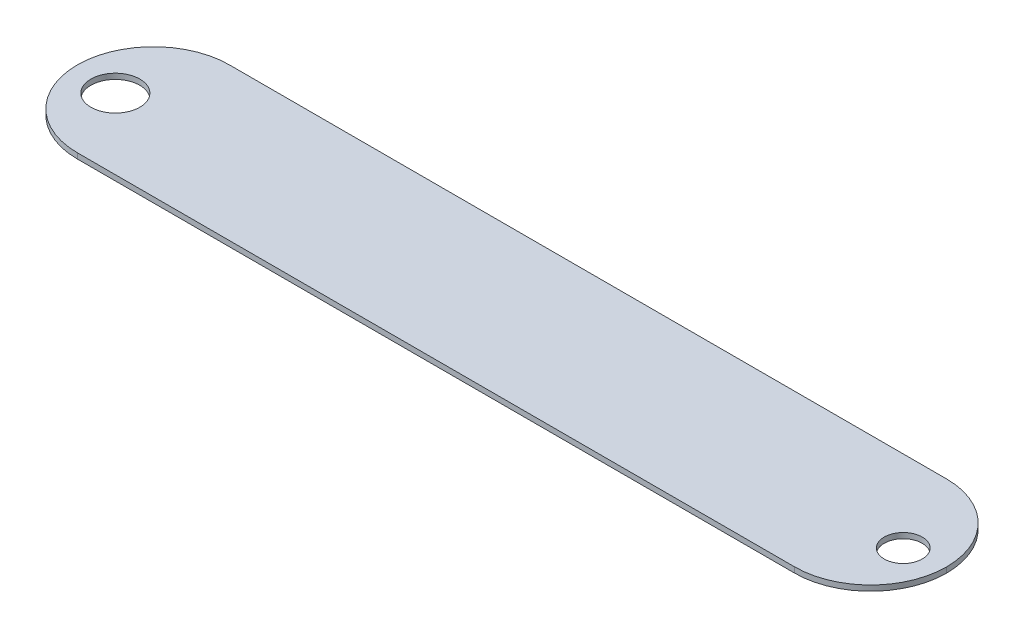
ISO-10303-21;
HEADER;
FILE_DESCRIPTION(('STEP AP214'),'2;1');
FILE_NAME('part.step','',(''),(''),'','','');
FILE_SCHEMA(('AUTOMOTIVE_DESIGN { 1 0 10303 214 1 1 1 1 }'));
ENDSEC;
DATA;
#1=APPLICATION_CONTEXT('core data for automotive mechanical design processes');
#2=APPLICATION_PROTOCOL_DEFINITION('international standard','automotive_design',2000,#1);
#3=PRODUCT_CONTEXT('',#1,'mechanical');
#4=PRODUCT('Part','Part','',(#3));
#5=PRODUCT_RELATED_PRODUCT_CATEGORY('part','',(#4));
#6=PRODUCT_DEFINITION_FORMATION('','',#4);
#7=PRODUCT_DEFINITION_CONTEXT('part definition',#1,'design');
#8=PRODUCT_DEFINITION('design','',#6,#7);
#9=PRODUCT_DEFINITION_SHAPE('','',#8);
#10=(LENGTH_UNIT() NAMED_UNIT(*) SI_UNIT(.MILLI.,.METRE.));
#11=(NAMED_UNIT(*) PLANE_ANGLE_UNIT() SI_UNIT($,.RADIAN.));
#12=(NAMED_UNIT(*) SI_UNIT($,.STERADIAN.) SOLID_ANGLE_UNIT());
#13=UNCERTAINTY_MEASURE_WITH_UNIT(LENGTH_MEASURE(1.E-05),#10,'distance_accuracy_value','');
#14=(GEOMETRIC_REPRESENTATION_CONTEXT(3) GLOBAL_UNCERTAINTY_ASSIGNED_CONTEXT((#13)) GLOBAL_UNIT_ASSIGNED_CONTEXT((#10,
#11,#12)) REPRESENTATION_CONTEXT('',''));
#15=CARTESIAN_POINT('',(0.,0.,0.));
#16=DIRECTION('',(0.,0.,1.));
#17=DIRECTION('',(1.,0.,0.));
#18=AXIS2_PLACEMENT_3D('',#15,#16,#17);
#19=CARTESIAN_POINT('',(0.,0.5,0.));
#20=DIRECTION('',(0.,1.,0.));
#21=DIRECTION('',(0.,0.,1.));
#22=AXIS2_PLACEMENT_3D('',#19,#20,#21);
#23=PLANE('',#22);
#24=CARTESIAN_POINT('',(4.,0.5,7.5));
#25=DIRECTION('',(0.,1.,0.));
#26=DIRECTION('',(0.,0.,1.));
#27=AXIS2_PLACEMENT_3D('',#24,#25,#26);
#28=CIRCLE('',#27,2.25);
#29=CARTESIAN_POINT('',(4.,0.5,9.75));
#30=VERTEX_POINT('',#29);
#31=EDGE_CURVE('E141',#30,#30,#28,.T.);
#32=ORIENTED_EDGE('',*,*,#31,.F.);
#33=EDGE_LOOP('',(#32));
#34=FACE_BOUND('',#33,.T.);
#35=CARTESIAN_POINT('',(73.,0.5,7.));
#36=DIRECTION('',(0.,1.,0.));
#37=DIRECTION('',(0.,0.,1.));
#38=AXIS2_PLACEMENT_3D('',#35,#36,#37);
#39=CIRCLE('',#38,7.);
#40=CARTESIAN_POINT('',(73.,0.5,14.));
#41=VERTEX_POINT('',#40);
#42=CARTESIAN_POINT('',(80.,0.5,7.));
#43=VERTEX_POINT('',#42);
#44=EDGE_CURVE('E52',#41,#43,#39,.T.);
#45=ORIENTED_EDGE('',*,*,#44,.T.);
#46=CARTESIAN_POINT('',(73.,0.5,7.));
#47=DIRECTION('',(0.,1.,0.));
#48=DIRECTION('',(0.,0.,1.));
#49=AXIS2_PLACEMENT_3D('',#46,#47,#48);
#50=CIRCLE('',#49,7.);
#51=CARTESIAN_POINT('',(73.,0.5,0.));
#52=VERTEX_POINT('',#51);
#53=EDGE_CURVE('E129',#43,#52,#50,.T.);
#54=ORIENTED_EDGE('',*,*,#53,.T.);
#55=DIRECTION('',(-1.,0.,0.));
#56=VECTOR('',#55,1.);
#57=CARTESIAN_POINT('',(0.,0.5,0.));
#58=LINE('',#57,#56);
#59=CARTESIAN_POINT('',(7.,0.5,0.));
#60=VERTEX_POINT('',#59);
#61=EDGE_CURVE('E101',#52,#60,#58,.T.);
#62=ORIENTED_EDGE('',*,*,#61,.T.);
#63=CARTESIAN_POINT('',(7.,0.5,7.));
#64=DIRECTION('',(0.,1.,0.));
#65=DIRECTION('',(0.,0.,1.));
#66=AXIS2_PLACEMENT_3D('',#63,#64,#65);
#67=CIRCLE('',#66,7.);
#68=CARTESIAN_POINT('',(0.,0.5,7.));
#69=VERTEX_POINT('',#68);
#70=EDGE_CURVE('E126',#60,#69,#67,.T.);
#71=ORIENTED_EDGE('',*,*,#70,.T.);
#72=CARTESIAN_POINT('',(7.,0.5,7.));
#73=DIRECTION('',(0.,1.,0.));
#74=DIRECTION('',(0.,0.,1.));
#75=AXIS2_PLACEMENT_3D('',#72,#73,#74);
#76=CIRCLE('',#75,7.);
#77=CARTESIAN_POINT('',(7.,0.5,14.));
#78=VERTEX_POINT('',#77);
#79=EDGE_CURVE('E107',#69,#78,#76,.T.);
#80=ORIENTED_EDGE('',*,*,#79,.T.);
#81=DIRECTION('',(1.,0.,0.));
#82=VECTOR('',#81,1.);
#83=CARTESIAN_POINT('',(0.,0.5,14.));
#84=LINE('',#83,#82);
#85=EDGE_CURVE('E132',#78,#41,#84,.T.);
#86=ORIENTED_EDGE('',*,*,#85,.T.);
#87=EDGE_LOOP('',(#45,#54,#62,#71,#80,#86));
#88=FACE_BOUND('',#87,.T.);
#89=CARTESIAN_POINT('',(76.5,0.5,7.5));
#90=DIRECTION('',(0.,1.,0.));
#91=DIRECTION('',(0.,0.,1.));
#92=AXIS2_PLACEMENT_3D('',#89,#90,#91);
#93=CIRCLE('',#92,1.75);
#94=CARTESIAN_POINT('',(76.5,0.5,9.25));
#95=VERTEX_POINT('',#94);
#96=EDGE_CURVE('E146',#95,#95,#93,.T.);
#97=ORIENTED_EDGE('',*,*,#96,.F.);
#98=EDGE_LOOP('',(#97));
#99=FACE_BOUND('',#98,.T.);
#100=ADVANCED_FACE('F35',(#34,#88,#99),#23,.T.);
#101=CARTESIAN_POINT('',(0.,0.,0.));
#102=DIRECTION('',(0.,1.,0.));
#103=DIRECTION('',(0.,0.,1.));
#104=AXIS2_PLACEMENT_3D('',#101,#102,#103);
#105=PLANE('',#104);
#106=DIRECTION('',(-1.,0.,0.));
#107=VECTOR('',#106,1.);
#108=CARTESIAN_POINT('',(0.,0.,0.));
#109=LINE('',#108,#107);
#110=CARTESIAN_POINT('',(73.,0.,0.));
#111=VERTEX_POINT('',#110);
#112=CARTESIAN_POINT('',(7.,0.,0.));
#113=VERTEX_POINT('',#112);
#114=EDGE_CURVE('E133',#111,#113,#109,.T.);
#115=ORIENTED_EDGE('',*,*,#114,.F.);
#116=CARTESIAN_POINT('',(73.,0.,7.));
#117=DIRECTION('',(0.,1.,0.));
#118=DIRECTION('',(0.,0.,1.));
#119=AXIS2_PLACEMENT_3D('',#116,#117,#118);
#120=CIRCLE('',#119,7.);
#121=CARTESIAN_POINT('',(80.,0.,7.));
#122=VERTEX_POINT('',#121);
#123=EDGE_CURVE('E116',#111,#122,#120,.F.);
#124=ORIENTED_EDGE('',*,*,#123,.T.);
#125=CARTESIAN_POINT('',(73.,0.,7.));
#126=DIRECTION('',(0.,1.,0.));
#127=DIRECTION('',(0.,0.,1.));
#128=AXIS2_PLACEMENT_3D('',#125,#126,#127);
#129=CIRCLE('',#128,7.);
#130=CARTESIAN_POINT('',(73.,0.,14.));
#131=VERTEX_POINT('',#130);
#132=EDGE_CURVE('E114',#122,#131,#129,.F.);
#133=ORIENTED_EDGE('',*,*,#132,.T.);
#134=DIRECTION('',(1.,0.,0.));
#135=VECTOR('',#134,1.);
#136=CARTESIAN_POINT('',(0.,0.,14.));
#137=LINE('',#136,#135);
#138=CARTESIAN_POINT('',(7.,0.,14.));
#139=VERTEX_POINT('',#138);
#140=EDGE_CURVE('E98',#139,#131,#137,.T.);
#141=ORIENTED_EDGE('',*,*,#140,.F.);
#142=CARTESIAN_POINT('',(7.,0.,7.));
#143=DIRECTION('',(0.,1.,0.));
#144=DIRECTION('',(0.,0.,1.));
#145=AXIS2_PLACEMENT_3D('',#142,#143,#144);
#146=CIRCLE('',#145,7.);
#147=CARTESIAN_POINT('',(0.,0.,7.));
#148=VERTEX_POINT('',#147);
#149=EDGE_CURVE('E90',#139,#148,#146,.F.);
#150=ORIENTED_EDGE('',*,*,#149,.T.);
#151=CARTESIAN_POINT('',(7.,0.,7.));
#152=DIRECTION('',(0.,1.,0.));
#153=DIRECTION('',(0.,0.,1.));
#154=AXIS2_PLACEMENT_3D('',#151,#152,#153);
#155=CIRCLE('',#154,7.);
#156=EDGE_CURVE('E96',#148,#113,#155,.F.);
#157=ORIENTED_EDGE('',*,*,#156,.T.);
#158=EDGE_LOOP('',(#115,#124,#133,#141,#150,#157));
#159=FACE_BOUND('',#158,.T.);
#160=CARTESIAN_POINT('',(4.,0.,7.5));
#161=DIRECTION('',(0.,1.,0.));
#162=DIRECTION('',(0.,0.,1.));
#163=AXIS2_PLACEMENT_3D('',#160,#161,#162);
#164=CIRCLE('',#163,2.25);
#165=CARTESIAN_POINT('',(4.,0.,9.75));
#166=VERTEX_POINT('',#165);
#167=EDGE_CURVE('E138',#166,#166,#164,.T.);
#168=ORIENTED_EDGE('',*,*,#167,.T.);
#169=EDGE_LOOP('',(#168));
#170=FACE_BOUND('',#169,.T.);
#171=CARTESIAN_POINT('',(76.5,0.,7.5));
#172=DIRECTION('',(0.,1.,0.));
#173=DIRECTION('',(0.,0.,1.));
#174=AXIS2_PLACEMENT_3D('',#171,#172,#173);
#175=CIRCLE('',#174,1.75);
#176=CARTESIAN_POINT('',(76.5,0.,9.25));
#177=VERTEX_POINT('',#176);
#178=EDGE_CURVE('E109',#177,#177,#175,.T.);
#179=ORIENTED_EDGE('',*,*,#178,.T.);
#180=EDGE_LOOP('',(#179));
#181=FACE_BOUND('',#180,.T.);
#182=ADVANCED_FACE('F93',(#159,#170,#181),#105,.F.);
#183=CARTESIAN_POINT('',(0.,0.5,14.));
#184=DIRECTION('',(0.,0.,-1.));
#185=DIRECTION('',(-1.,0.,0.));
#186=AXIS2_PLACEMENT_3D('',#183,#184,#185);
#187=PLANE('',#186);
#188=ORIENTED_EDGE('',*,*,#140,.T.);
#189=DIRECTION('',(0.,-1.,0.));
#190=VECTOR('',#189,1.);
#191=CARTESIAN_POINT('',(73.,0.5,14.));
#192=LINE('',#191,#190);
#193=EDGE_CURVE('E11',#131,#41,#192,.F.);
#194=ORIENTED_EDGE('',*,*,#193,.T.);
#195=ORIENTED_EDGE('',*,*,#85,.F.);
#196=DIRECTION('',(0.,-1.,0.));
#197=VECTOR('',#196,1.);
#198=CARTESIAN_POINT('',(7.,0.5,14.));
#199=LINE('',#198,#197);
#200=EDGE_CURVE('E44',#78,#139,#199,.T.);
#201=ORIENTED_EDGE('',*,*,#200,.T.);
#202=EDGE_LOOP('',(#188,#194,#195,#201));
#203=FACE_BOUND('',#202,.T.);
#204=ADVANCED_FACE('F131',(#203),#187,.F.);
#205=CARTESIAN_POINT('',(0.,0.5,0.));
#206=DIRECTION('',(0.,0.,1.));
#207=DIRECTION('',(1.,0.,0.));
#208=AXIS2_PLACEMENT_3D('',#205,#206,#207);
#209=PLANE('',#208);
#210=ORIENTED_EDGE('',*,*,#114,.T.);
#211=DIRECTION('',(0.,-1.,0.));
#212=VECTOR('',#211,1.);
#213=CARTESIAN_POINT('',(7.,0.5,0.));
#214=LINE('',#213,#212);
#215=EDGE_CURVE('E113',#113,#60,#214,.F.);
#216=ORIENTED_EDGE('',*,*,#215,.T.);
#217=ORIENTED_EDGE('',*,*,#61,.F.);
#218=DIRECTION('',(0.,-1.,0.));
#219=VECTOR('',#218,1.);
#220=CARTESIAN_POINT('',(73.,0.5,0.));
#221=LINE('',#220,#219);
#222=EDGE_CURVE('E121',#52,#111,#221,.T.);
#223=ORIENTED_EDGE('',*,*,#222,.T.);
#224=EDGE_LOOP('',(#210,#216,#217,#223));
#225=FACE_BOUND('',#224,.T.);
#226=ADVANCED_FACE('F167',(#225),#209,.F.);
#227=CARTESIAN_POINT('',(4.,0.5,7.5));
#228=DIRECTION('',(0.,-1.,0.));
#229=DIRECTION('',(0.,0.,-1.));
#230=AXIS2_PLACEMENT_3D('',#227,#228,#229);
#231=CYLINDRICAL_SURFACE('',#230,2.25);
#232=ORIENTED_EDGE('',*,*,#31,.T.);
#233=EDGE_LOOP('',(#232));
#234=FACE_BOUND('',#233,.T.);
#235=ORIENTED_EDGE('',*,*,#167,.F.);
#236=EDGE_LOOP('',(#235));
#237=FACE_BOUND('',#236,.T.);
#238=ADVANCED_FACE('F164',(#234,#237),#231,.F.);
#239=CARTESIAN_POINT('',(76.5,0.5,7.5));
#240=DIRECTION('',(0.,-1.,0.));
#241=DIRECTION('',(0.,0.,-1.));
#242=AXIS2_PLACEMENT_3D('',#239,#240,#241);
#243=CYLINDRICAL_SURFACE('',#242,1.75);
#244=ORIENTED_EDGE('',*,*,#96,.T.);
#245=EDGE_LOOP('',(#244));
#246=FACE_BOUND('',#245,.T.);
#247=ORIENTED_EDGE('',*,*,#178,.F.);
#248=EDGE_LOOP('',(#247));
#249=FACE_BOUND('',#248,.T.);
#250=ADVANCED_FACE('F153',(#246,#249),#243,.F.);
#251=CARTESIAN_POINT('',(7.,0.5,7.));
#252=DIRECTION('',(0.,-1.,0.));
#253=DIRECTION('',(0.,0.,-1.));
#254=AXIS2_PLACEMENT_3D('',#251,#252,#253);
#255=CYLINDRICAL_SURFACE('',#254,7.);
#256=ORIENTED_EDGE('',*,*,#200,.F.);
#257=ORIENTED_EDGE('',*,*,#79,.F.);
#258=DIRECTION('',(0.,-1.,0.));
#259=VECTOR('',#258,1.);
#260=CARTESIAN_POINT('',(0.,0.5,7.));
#261=LINE('',#260,#259);
#262=EDGE_CURVE('E105',#148,#69,#261,.F.);
#263=ORIENTED_EDGE('',*,*,#262,.F.);
#264=ORIENTED_EDGE('',*,*,#149,.F.);
#265=EDGE_LOOP('',(#256,#257,#263,#264));
#266=FACE_BOUND('',#265,.T.);
#267=ADVANCED_FACE('F106',(#266),#255,.T.);
#268=CARTESIAN_POINT('',(7.,0.5,7.));
#269=DIRECTION('',(0.,-1.,0.));
#270=DIRECTION('',(0.,0.,-1.));
#271=AXIS2_PLACEMENT_3D('',#268,#269,#270);
#272=CYLINDRICAL_SURFACE('',#271,7.);
#273=ORIENTED_EDGE('',*,*,#70,.F.);
#274=ORIENTED_EDGE('',*,*,#215,.F.);
#275=ORIENTED_EDGE('',*,*,#156,.F.);
#276=ORIENTED_EDGE('',*,*,#262,.T.);
#277=EDGE_LOOP('',(#273,#274,#275,#276));
#278=FACE_BOUND('',#277,.T.);
#279=ADVANCED_FACE('F111',(#278),#272,.T.);
#280=CARTESIAN_POINT('',(73.,0.5,7.));
#281=DIRECTION('',(0.,-1.,0.));
#282=DIRECTION('',(0.,0.,-1.));
#283=AXIS2_PLACEMENT_3D('',#280,#281,#282);
#284=CYLINDRICAL_SURFACE('',#283,7.);
#285=DIRECTION('',(0.,-1.,0.));
#286=VECTOR('',#285,1.);
#287=CARTESIAN_POINT('',(80.,0.5,7.));
#288=LINE('',#287,#286);
#289=EDGE_CURVE('E39',#43,#122,#288,.T.);
#290=ORIENTED_EDGE('',*,*,#289,.F.);
#291=ORIENTED_EDGE('',*,*,#44,.F.);
#292=ORIENTED_EDGE('',*,*,#193,.F.);
#293=ORIENTED_EDGE('',*,*,#132,.F.);
#294=EDGE_LOOP('',(#290,#291,#292,#293));
#295=FACE_BOUND('',#294,.T.);
#296=ADVANCED_FACE('F37',(#295),#284,.T.);
#297=CARTESIAN_POINT('',(73.,0.5,7.));
#298=DIRECTION('',(0.,-1.,0.));
#299=DIRECTION('',(0.,0.,-1.));
#300=AXIS2_PLACEMENT_3D('',#297,#298,#299);
#301=CYLINDRICAL_SURFACE('',#300,7.);
#302=ORIENTED_EDGE('',*,*,#53,.F.);
#303=ORIENTED_EDGE('',*,*,#289,.T.);
#304=ORIENTED_EDGE('',*,*,#123,.F.);
#305=ORIENTED_EDGE('',*,*,#222,.F.);
#306=EDGE_LOOP('',(#302,#303,#304,#305));
#307=FACE_BOUND('',#306,.T.);
#308=ADVANCED_FACE('F176',(#307),#301,.T.);
#309=CLOSED_SHELL('',(#100,#182,#204,#226,#238,#250,#267,#279,#296,#308));
#310=MANIFOLD_SOLID_BREP('B2',#309);
#311=ADVANCED_BREP_SHAPE_REPRESENTATION('',(#18,#310),#14);
#312=SHAPE_DEFINITION_REPRESENTATION(#9,#311);
ENDSEC;
END-ISO-10303-21;
